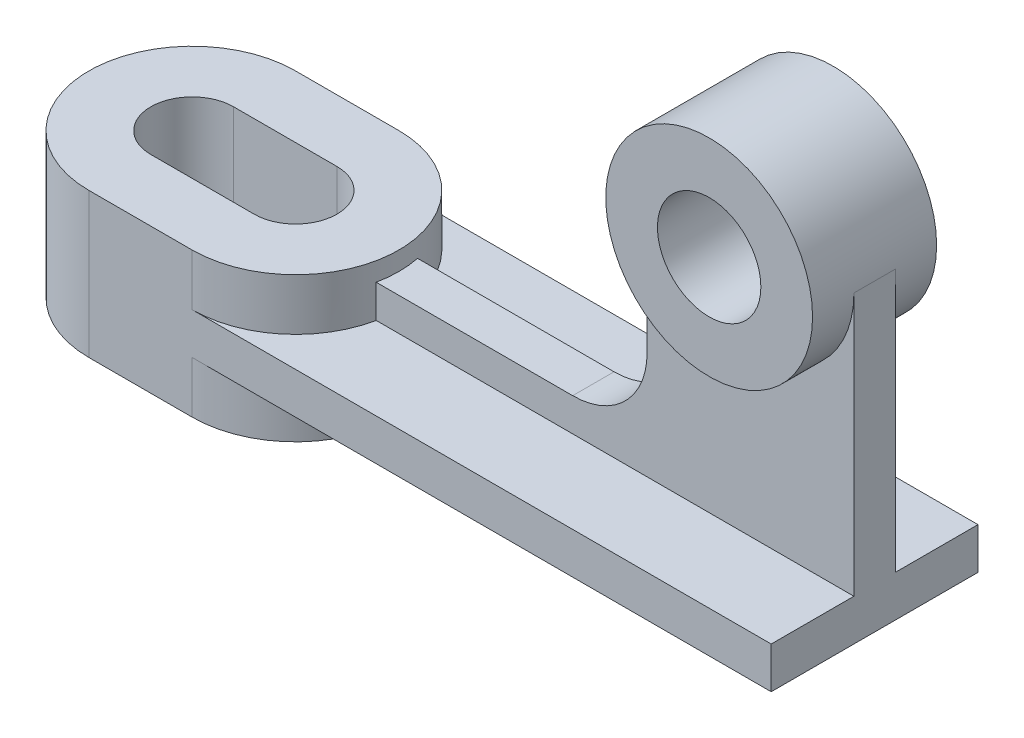
ISO-10303-21;
HEADER;
FILE_DESCRIPTION(('STEP AP214'),'2;1');
FILE_NAME('part.step','',(''),(''),'','','');
FILE_SCHEMA(('AUTOMOTIVE_DESIGN { 1 0 10303 214 1 1 1 1 }'));
ENDSEC;
DATA;
#1=APPLICATION_CONTEXT('core data for automotive mechanical design processes');
#2=APPLICATION_PROTOCOL_DEFINITION('international standard','automotive_design',2000,#1);
#3=PRODUCT_CONTEXT('',#1,'mechanical');
#4=PRODUCT('Part','Part','',(#3));
#5=PRODUCT_RELATED_PRODUCT_CATEGORY('part','',(#4));
#6=PRODUCT_DEFINITION_FORMATION('','',#4);
#7=PRODUCT_DEFINITION_CONTEXT('part definition',#1,'design');
#8=PRODUCT_DEFINITION('design','',#6,#7);
#9=PRODUCT_DEFINITION_SHAPE('','',#8);
#10=(LENGTH_UNIT() NAMED_UNIT(*) SI_UNIT(.MILLI.,.METRE.));
#11=(NAMED_UNIT(*) PLANE_ANGLE_UNIT() SI_UNIT($,.RADIAN.));
#12=(NAMED_UNIT(*) SI_UNIT($,.STERADIAN.) SOLID_ANGLE_UNIT());
#13=UNCERTAINTY_MEASURE_WITH_UNIT(LENGTH_MEASURE(1.E-05),#10,'distance_accuracy_value','');
#14=(GEOMETRIC_REPRESENTATION_CONTEXT(3) GLOBAL_UNCERTAINTY_ASSIGNED_CONTEXT((#13)) GLOBAL_UNIT_ASSIGNED_CONTEXT((#10,
#11,#12)) REPRESENTATION_CONTEXT('',''));
#15=CARTESIAN_POINT('',(0.,0.,0.));
#16=DIRECTION('',(0.,0.,1.));
#17=DIRECTION('',(1.,0.,0.));
#18=AXIS2_PLACEMENT_3D('',#15,#16,#17);
#19=CARTESIAN_POINT('',(0.,18.,0.));
#20=DIRECTION('',(0.,1.,0.));
#21=DIRECTION('',(0.,0.,1.));
#22=AXIS2_PLACEMENT_3D('',#19,#20,#21);
#23=PLANE('',#22);
#24=DIRECTION('',(-1.,0.,0.));
#25=VECTOR('',#24,1.);
#26=CARTESIAN_POINT('',(0.,18.,5.));
#27=LINE('',#26,#25);
#28=CARTESIAN_POINT('',(26.3753555150692,18.,5.));
#29=VERTEX_POINT('',#28);
#30=CARTESIAN_POINT('',(-21.1297470570989,18.,5.));
#31=VERTEX_POINT('',#30);
#32=EDGE_CURVE('E207',#29,#31,#27,.T.);
#33=ORIENTED_EDGE('',*,*,#32,.F.);
#34=DIRECTION('',(0.,0.,1.));
#35=VECTOR('',#34,1.);
#36=CARTESIAN_POINT('',(26.3753555150692,18.,-5.));
#37=LINE('',#36,#35);
#38=CARTESIAN_POINT('',(26.3753555150692,18.,-5.));
#39=VERTEX_POINT('',#38);
#40=EDGE_CURVE('E209',#39,#29,#37,.T.);
#41=ORIENTED_EDGE('',*,*,#40,.F.);
#42=DIRECTION('',(-1.,0.,0.));
#43=VECTOR('',#42,1.);
#44=CARTESIAN_POINT('',(0.,18.,-5.));
#45=LINE('',#44,#43);
#46=CARTESIAN_POINT('',(-21.1297470570989,18.,-5.));
#47=VERTEX_POINT('',#46);
#48=EDGE_CURVE('E220',#39,#47,#45,.T.);
#49=ORIENTED_EDGE('',*,*,#48,.T.);
#50=CARTESIAN_POINT('',(-45.6246444849307,18.,0.));
#51=DIRECTION('',(0.,1.,0.));
#52=DIRECTION('',(0.,0.,1.));
#53=AXIS2_PLACEMENT_3D('',#50,#51,#52);
#54=CIRCLE('',#53,25.);
#55=EDGE_CURVE('E201',#31,#47,#54,.T.);
#56=ORIENTED_EDGE('',*,*,#55,.F.);
#57=EDGE_LOOP('',(#33,#41,#49,#56));
#58=FACE_BOUND('',#57,.T.);
#59=ADVANCED_FACE('F41',(#58),#23,.T.);
#60=CARTESIAN_POINT('',(-45.6246444849307,-12.5,0.));
#61=DIRECTION('',(0.,1.,0.));
#62=DIRECTION('',(0.,0.,1.));
#63=AXIS2_PLACEMENT_3D('',#60,#61,#62);
#64=CYLINDRICAL_SURFACE('',#63,25.);
#65=DIRECTION('',(0.,1.,0.));
#66=VECTOR('',#65,1.);
#67=CARTESIAN_POINT('',(-45.6246444849307,-12.5,-25.));
#68=LINE('',#67,#66);
#69=CARTESIAN_POINT('',(-45.6246444849307,-12.5,-25.));
#70=VERTEX_POINT('',#69);
#71=CARTESIAN_POINT('',(-45.6246444849307,0.,-25.));
#72=VERTEX_POINT('',#71);
#73=EDGE_CURVE('E345',#70,#72,#68,.T.);
#74=ORIENTED_EDGE('',*,*,#73,.T.);
#75=CARTESIAN_POINT('',(-45.6246444849307,0.,0.));
#76=DIRECTION('',(0.,1.,0.));
#77=DIRECTION('',(0.,0.,1.));
#78=AXIS2_PLACEMENT_3D('',#75,#76,#77);
#79=CIRCLE('',#78,25.);
#80=CARTESIAN_POINT('',(-45.6246444849307,0.,25.));
#81=VERTEX_POINT('',#80);
#82=EDGE_CURVE('E256',#81,#72,#79,.T.);
#83=ORIENTED_EDGE('',*,*,#82,.F.);
#84=DIRECTION('',(0.,1.,0.));
#85=VECTOR('',#84,1.);
#86=CARTESIAN_POINT('',(-45.6246444849307,-12.5,25.));
#87=LINE('',#86,#85);
#88=CARTESIAN_POINT('',(-45.6246444849307,-12.5,25.));
#89=VERTEX_POINT('',#88);
#90=EDGE_CURVE('E350',#89,#81,#87,.T.);
#91=ORIENTED_EDGE('',*,*,#90,.F.);
#92=CARTESIAN_POINT('',(-45.6246444849307,-12.5,0.));
#93=DIRECTION('',(0.,1.,0.));
#94=DIRECTION('',(0.,0.,1.));
#95=AXIS2_PLACEMENT_3D('',#92,#93,#94);
#96=CIRCLE('',#95,25.);
#97=EDGE_CURVE('E332',#89,#70,#96,.T.);
#98=ORIENTED_EDGE('',*,*,#97,.T.);
#99=EDGE_LOOP('',(#74,#83,#91,#98));
#100=FACE_BOUND('',#99,.T.);
#101=ADVANCED_FACE('F388',(#100),#64,.T.);
#102=CARTESIAN_POINT('',(0.,-12.5,25.));
#103=DIRECTION('',(0.,0.,1.));
#104=DIRECTION('',(1.,0.,0.));
#105=AXIS2_PLACEMENT_3D('',#102,#103,#104);
#106=PLANE('',#105);
#107=ORIENTED_EDGE('',*,*,#90,.T.);
#108=DIRECTION('',(-1.,0.,0.));
#109=VECTOR('',#108,1.);
#110=CARTESIAN_POINT('',(0.,0.,25.));
#111=LINE('',#110,#109);
#112=CARTESIAN_POINT('',(94.3753555150693,0.,25.));
#113=VERTEX_POINT('',#112);
#114=EDGE_CURVE('E67',#113,#81,#111,.T.);
#115=ORIENTED_EDGE('',*,*,#114,.F.);
#116=DIRECTION('',(0.,-1.,0.));
#117=VECTOR('',#116,1.);
#118=CARTESIAN_POINT('',(94.3753555150693,10.,25.));
#119=LINE('',#118,#117);
#120=CARTESIAN_POINT('',(94.3753555150693,10.,25.));
#121=VERTEX_POINT('',#120);
#122=EDGE_CURVE('E274',#121,#113,#119,.T.);
#123=ORIENTED_EDGE('',*,*,#122,.F.);
#124=DIRECTION('',(-1.,0.,0.));
#125=VECTOR('',#124,1.);
#126=CARTESIAN_POINT('',(0.,10.,25.));
#127=LINE('',#126,#125);
#128=CARTESIAN_POINT('',(-45.6246444849307,10.,25.));
#129=VERTEX_POINT('',#128);
#130=EDGE_CURVE('E261',#121,#129,#127,.T.);
#131=ORIENTED_EDGE('',*,*,#130,.T.);
#132=CARTESIAN_POINT('',(-45.6246444849307,22.5,25.));
#133=VERTEX_POINT('',#132);
#134=EDGE_CURVE('E354',#129,#133,#87,.T.);
#135=ORIENTED_EDGE('',*,*,#134,.T.);
#136=DIRECTION('',(1.,0.,0.));
#137=VECTOR('',#136,1.);
#138=CARTESIAN_POINT('',(0.,22.5,25.));
#139=LINE('',#138,#137);
#140=CARTESIAN_POINT('',(-70.6246444849307,22.5,25.));
#141=VERTEX_POINT('',#140);
#142=EDGE_CURVE('E299',#141,#133,#139,.T.);
#143=ORIENTED_EDGE('',*,*,#142,.F.);
#144=DIRECTION('',(0.,1.,0.));
#145=VECTOR('',#144,1.);
#146=CARTESIAN_POINT('',(-70.6246444849307,-12.5,25.));
#147=LINE('',#146,#145);
#148=CARTESIAN_POINT('',(-70.6246444849307,-12.5,25.));
#149=VERTEX_POINT('',#148);
#150=EDGE_CURVE('E11',#149,#141,#147,.T.);
#151=ORIENTED_EDGE('',*,*,#150,.F.);
#152=DIRECTION('',(1.,0.,0.));
#153=VECTOR('',#152,1.);
#154=CARTESIAN_POINT('',(0.,-12.5,25.));
#155=LINE('',#154,#153);
#156=EDGE_CURVE('E328',#149,#89,#155,.T.);
#157=ORIENTED_EDGE('',*,*,#156,.T.);
#158=EDGE_LOOP('',(#107,#115,#123,#131,#135,#143,#151,#157));
#159=FACE_BOUND('',#158,.T.);
#160=ADVANCED_FACE('F398',(#159),#106,.T.);
#161=CARTESIAN_POINT('',(-70.6246444849307,-12.5,0.));
#162=DIRECTION('',(0.,1.,0.));
#163=DIRECTION('',(0.,0.,1.));
#164=AXIS2_PLACEMENT_3D('',#161,#162,#163);
#165=CYLINDRICAL_SURFACE('',#164,25.);
#166=ORIENTED_EDGE('',*,*,#150,.T.);
#167=CARTESIAN_POINT('',(-70.6246444849307,22.5,0.));
#168=DIRECTION('',(0.,1.,0.));
#169=DIRECTION('',(0.,0.,1.));
#170=AXIS2_PLACEMENT_3D('',#167,#168,#169);
#171=CIRCLE('',#170,25.);
#172=CARTESIAN_POINT('',(-70.6246444849307,22.5,-25.));
#173=VERTEX_POINT('',#172);
#174=EDGE_CURVE('E311',#173,#141,#171,.T.);
#175=ORIENTED_EDGE('',*,*,#174,.F.);
#176=DIRECTION('',(0.,1.,0.));
#177=VECTOR('',#176,1.);
#178=CARTESIAN_POINT('',(-70.6246444849307,-12.5,-25.));
#179=LINE('',#178,#177);
#180=CARTESIAN_POINT('',(-70.6246444849307,-12.5,-25.));
#181=VERTEX_POINT('',#180);
#182=EDGE_CURVE('E51',#181,#173,#179,.T.);
#183=ORIENTED_EDGE('',*,*,#182,.F.);
#184=CARTESIAN_POINT('',(-70.6246444849307,-12.5,0.));
#185=DIRECTION('',(0.,1.,0.));
#186=DIRECTION('',(0.,0.,1.));
#187=AXIS2_PLACEMENT_3D('',#184,#185,#186);
#188=CIRCLE('',#187,25.);
#189=EDGE_CURVE('E339',#181,#149,#188,.T.);
#190=ORIENTED_EDGE('',*,*,#189,.T.);
#191=EDGE_LOOP('',(#166,#175,#183,#190));
#192=FACE_BOUND('',#191,.T.);
#193=ADVANCED_FACE('F430',(#192),#165,.T.);
#194=CARTESIAN_POINT('',(0.,-12.5,-25.));
#195=DIRECTION('',(0.,0.,1.));
#196=DIRECTION('',(1.,0.,0.));
#197=AXIS2_PLACEMENT_3D('',#194,#195,#196);
#198=PLANE('',#197);
#199=ORIENTED_EDGE('',*,*,#182,.T.);
#200=DIRECTION('',(1.,0.,0.));
#201=VECTOR('',#200,1.);
#202=CARTESIAN_POINT('',(0.,22.5,-25.));
#203=LINE('',#202,#201);
#204=CARTESIAN_POINT('',(-45.6246444849307,22.5,-25.));
#205=VERTEX_POINT('',#204);
#206=EDGE_CURVE('E307',#173,#205,#203,.T.);
#207=ORIENTED_EDGE('',*,*,#206,.T.);
#208=CARTESIAN_POINT('',(-45.6246444849307,10.,-25.));
#209=VERTEX_POINT('',#208);
#210=EDGE_CURVE('E349',#209,#205,#68,.T.);
#211=ORIENTED_EDGE('',*,*,#210,.F.);
#212=DIRECTION('',(-1.,0.,0.));
#213=VECTOR('',#212,1.);
#214=CARTESIAN_POINT('',(0.,10.,-25.));
#215=LINE('',#214,#213);
#216=CARTESIAN_POINT('',(94.3753555150693,10.,-25.));
#217=VERTEX_POINT('',#216);
#218=EDGE_CURVE('E246',#217,#209,#215,.T.);
#219=ORIENTED_EDGE('',*,*,#218,.F.);
#220=DIRECTION('',(0.,-1.,0.));
#221=VECTOR('',#220,1.);
#222=CARTESIAN_POINT('',(94.3753555150693,10.,-25.));
#223=LINE('',#222,#221);
#224=CARTESIAN_POINT('',(94.3753555150693,0.,-25.));
#225=VERTEX_POINT('',#224);
#226=EDGE_CURVE('E249',#217,#225,#223,.T.);
#227=ORIENTED_EDGE('',*,*,#226,.T.);
#228=DIRECTION('',(-1.,0.,0.));
#229=VECTOR('',#228,1.);
#230=CARTESIAN_POINT('',(0.,0.,-25.));
#231=LINE('',#230,#229);
#232=EDGE_CURVE('E235',#225,#72,#231,.T.);
#233=ORIENTED_EDGE('',*,*,#232,.T.);
#234=ORIENTED_EDGE('',*,*,#73,.F.);
#235=DIRECTION('',(1.,0.,0.));
#236=VECTOR('',#235,1.);
#237=CARTESIAN_POINT('',(0.,-12.5,-25.));
#238=LINE('',#237,#236);
#239=EDGE_CURVE('E336',#181,#70,#238,.T.);
#240=ORIENTED_EDGE('',*,*,#239,.F.);
#241=EDGE_LOOP('',(#199,#207,#211,#219,#227,#233,#234,#240));
#242=FACE_BOUND('',#241,.T.);
#243=ADVANCED_FACE('F433',(#242),#198,.F.);
#244=CARTESIAN_POINT('',(-45.6246444849307,-12.5,0.));
#245=DIRECTION('',(0.,1.,0.));
#246=DIRECTION('',(0.,0.,1.));
#247=AXIS2_PLACEMENT_3D('',#244,#245,#246);
#248=CYLINDRICAL_SURFACE('',#247,10.);
#249=DIRECTION('',(0.,1.,0.));
#250=VECTOR('',#249,1.);
#251=CARTESIAN_POINT('',(-45.6246444849307,-12.5,10.));
#252=LINE('',#251,#250);
#253=CARTESIAN_POINT('',(-45.6246444849307,-12.5,10.));
#254=VERTEX_POINT('',#253);
#255=CARTESIAN_POINT('',(-45.6246444849307,22.5,10.));
#256=VERTEX_POINT('',#255);
#257=EDGE_CURVE('E45',#254,#256,#252,.T.);
#258=ORIENTED_EDGE('',*,*,#257,.T.);
#259=CARTESIAN_POINT('',(-45.6246444849307,22.5,0.));
#260=DIRECTION('',(0.,1.,0.));
#261=DIRECTION('',(0.,0.,1.));
#262=AXIS2_PLACEMENT_3D('',#259,#260,#261);
#263=CIRCLE('',#262,10.);
#264=CARTESIAN_POINT('',(-45.6246444849307,22.5,-10.));
#265=VERTEX_POINT('',#264);
#266=EDGE_CURVE('E283',#256,#265,#263,.T.);
#267=ORIENTED_EDGE('',*,*,#266,.T.);
#268=DIRECTION('',(0.,1.,0.));
#269=VECTOR('',#268,1.);
#270=CARTESIAN_POINT('',(-45.6246444849307,-12.5,-10.));
#271=LINE('',#270,#269);
#272=CARTESIAN_POINT('',(-45.6246444849307,-12.5,-10.));
#273=VERTEX_POINT('',#272);
#274=EDGE_CURVE('E355',#273,#265,#271,.T.);
#275=ORIENTED_EDGE('',*,*,#274,.F.);
#276=CARTESIAN_POINT('',(-45.6246444849307,-12.5,0.));
#277=DIRECTION('',(0.,1.,0.));
#278=DIRECTION('',(0.,0.,1.));
#279=AXIS2_PLACEMENT_3D('',#276,#277,#278);
#280=CIRCLE('',#279,10.);
#281=EDGE_CURVE('E315',#254,#273,#280,.T.);
#282=ORIENTED_EDGE('',*,*,#281,.F.);
#283=EDGE_LOOP('',(#258,#267,#275,#282));
#284=FACE_BOUND('',#283,.T.);
#285=ADVANCED_FACE('F43',(#284),#248,.F.);
#286=CARTESIAN_POINT('',(0.,-12.5,-10.));
#287=DIRECTION('',(0.,0.,1.));
#288=DIRECTION('',(1.,0.,0.));
#289=AXIS2_PLACEMENT_3D('',#286,#287,#288);
#290=PLANE('',#289);
#291=ORIENTED_EDGE('',*,*,#274,.T.);
#292=DIRECTION('',(1.,0.,0.));
#293=VECTOR('',#292,1.);
#294=CARTESIAN_POINT('',(0.,22.5,-10.));
#295=LINE('',#294,#293);
#296=CARTESIAN_POINT('',(-70.6246444849307,22.5,-10.));
#297=VERTEX_POINT('',#296);
#298=EDGE_CURVE('E295',#297,#265,#295,.T.);
#299=ORIENTED_EDGE('',*,*,#298,.F.);
#300=DIRECTION('',(0.,1.,0.));
#301=VECTOR('',#300,1.);
#302=CARTESIAN_POINT('',(-70.6246444849307,-12.5,-10.));
#303=LINE('',#302,#301);
#304=CARTESIAN_POINT('',(-70.6246444849307,-12.5,-10.));
#305=VERTEX_POINT('',#304);
#306=EDGE_CURVE('E358',#305,#297,#303,.T.);
#307=ORIENTED_EDGE('',*,*,#306,.F.);
#308=DIRECTION('',(1.,0.,0.));
#309=VECTOR('',#308,1.);
#310=CARTESIAN_POINT('',(0.,-12.5,-10.));
#311=LINE('',#310,#309);
#312=EDGE_CURVE('E324',#305,#273,#311,.T.);
#313=ORIENTED_EDGE('',*,*,#312,.T.);
#314=EDGE_LOOP('',(#291,#299,#307,#313));
#315=FACE_BOUND('',#314,.T.);
#316=ADVANCED_FACE('F389',(#315),#290,.T.);
#317=CARTESIAN_POINT('',(-70.6246444849307,-12.5,0.));
#318=DIRECTION('',(0.,1.,0.));
#319=DIRECTION('',(0.,0.,1.));
#320=AXIS2_PLACEMENT_3D('',#317,#318,#319);
#321=CYLINDRICAL_SURFACE('',#320,10.);
#322=ORIENTED_EDGE('',*,*,#306,.T.);
#323=CARTESIAN_POINT('',(-70.6246444849307,22.5,0.));
#324=DIRECTION('',(0.,1.,0.));
#325=DIRECTION('',(0.,0.,1.));
#326=AXIS2_PLACEMENT_3D('',#323,#324,#325);
#327=CIRCLE('',#326,10.);
#328=CARTESIAN_POINT('',(-70.6246444849307,22.5,10.));
#329=VERTEX_POINT('',#328);
#330=EDGE_CURVE('E291',#297,#329,#327,.T.);
#331=ORIENTED_EDGE('',*,*,#330,.T.);
#332=DIRECTION('',(0.,1.,0.));
#333=VECTOR('',#332,1.);
#334=CARTESIAN_POINT('',(-70.6246444849307,-12.5,10.));
#335=LINE('',#334,#333);
#336=CARTESIAN_POINT('',(-70.6246444849307,-12.5,10.));
#337=VERTEX_POINT('',#336);
#338=EDGE_CURVE('E360',#337,#329,#335,.T.);
#339=ORIENTED_EDGE('',*,*,#338,.F.);
#340=CARTESIAN_POINT('',(-70.6246444849307,-12.5,0.));
#341=DIRECTION('',(0.,1.,0.));
#342=DIRECTION('',(0.,0.,1.));
#343=AXIS2_PLACEMENT_3D('',#340,#341,#342);
#344=CIRCLE('',#343,10.);
#345=EDGE_CURVE('E321',#305,#337,#344,.T.);
#346=ORIENTED_EDGE('',*,*,#345,.F.);
#347=EDGE_LOOP('',(#322,#331,#339,#346));
#348=FACE_BOUND('',#347,.T.);
#349=ADVANCED_FACE('F380',(#348),#321,.F.);
#350=CARTESIAN_POINT('',(0.,-12.5,10.));
#351=DIRECTION('',(0.,0.,1.));
#352=DIRECTION('',(1.,0.,0.));
#353=AXIS2_PLACEMENT_3D('',#350,#351,#352);
#354=PLANE('',#353);
#355=ORIENTED_EDGE('',*,*,#338,.T.);
#356=DIRECTION('',(1.,0.,0.));
#357=VECTOR('',#356,1.);
#358=CARTESIAN_POINT('',(0.,22.5,10.));
#359=LINE('',#358,#357);
#360=EDGE_CURVE('E287',#329,#256,#359,.T.);
#361=ORIENTED_EDGE('',*,*,#360,.T.);
#362=ORIENTED_EDGE('',*,*,#257,.F.);
#363=DIRECTION('',(1.,0.,0.));
#364=VECTOR('',#363,1.);
#365=CARTESIAN_POINT('',(0.,-12.5,10.));
#366=LINE('',#365,#364);
#367=EDGE_CURVE('E318',#337,#254,#366,.T.);
#368=ORIENTED_EDGE('',*,*,#367,.F.);
#369=EDGE_LOOP('',(#355,#361,#362,#368));
#370=FACE_BOUND('',#369,.T.);
#371=ADVANCED_FACE('F377',(#370),#354,.F.);
#372=DIRECTION('',(0.,-1.,0.));
#373=VECTOR('',#372,1.);
#374=CARTESIAN_POINT('',(-21.1297470570989,18.,5.));
#375=LINE('',#374,#373);
#376=CARTESIAN_POINT('',(-21.1297470570989,10.,5.));
#377=VERTEX_POINT('',#376);
#378=EDGE_CURVE('E232',#31,#377,#375,.T.);
#379=ORIENTED_EDGE('',*,*,#378,.F.);
#380=ORIENTED_EDGE('',*,*,#55,.T.);
#381=DIRECTION('',(0.,-1.,0.));
#382=VECTOR('',#381,1.);
#383=CARTESIAN_POINT('',(-21.1297470570989,18.,-5.));
#384=LINE('',#383,#382);
#385=CARTESIAN_POINT('',(-21.1297470570989,10.,-5.));
#386=VERTEX_POINT('',#385);
#387=EDGE_CURVE('E223',#47,#386,#384,.T.);
#388=ORIENTED_EDGE('',*,*,#387,.T.);
#389=CARTESIAN_POINT('',(-45.6246444849307,10.,0.));
#390=DIRECTION('',(0.,1.,0.));
#391=DIRECTION('',(0.,0.,1.));
#392=AXIS2_PLACEMENT_3D('',#389,#390,#391);
#393=CIRCLE('',#392,25.);
#394=EDGE_CURVE('E236',#386,#209,#393,.T.);
#395=ORIENTED_EDGE('',*,*,#394,.T.);
#396=ORIENTED_EDGE('',*,*,#210,.T.);
#397=CARTESIAN_POINT('',(-45.6246444849307,22.5,0.));
#398=DIRECTION('',(0.,1.,0.));
#399=DIRECTION('',(0.,0.,1.));
#400=AXIS2_PLACEMENT_3D('',#397,#398,#399);
#401=CIRCLE('',#400,25.);
#402=EDGE_CURVE('E303',#133,#205,#401,.T.);
#403=ORIENTED_EDGE('',*,*,#402,.F.);
#404=ORIENTED_EDGE('',*,*,#134,.F.);
#405=CARTESIAN_POINT('',(-45.6246444849307,10.,0.));
#406=DIRECTION('',(0.,1.,0.));
#407=DIRECTION('',(0.,0.,1.));
#408=AXIS2_PLACEMENT_3D('',#405,#406,#407);
#409=CIRCLE('',#408,25.);
#410=EDGE_CURVE('E257',#129,#377,#409,.T.);
#411=ORIENTED_EDGE('',*,*,#410,.T.);
#412=EDGE_LOOP('',(#379,#380,#388,#395,#396,#403,#404,#411));
#413=FACE_BOUND('',#412,.T.);
#414=ADVANCED_FACE('F379',(#413),#64,.T.);
#415=CARTESIAN_POINT('',(0.,-12.5,0.));
#416=DIRECTION('',(0.,1.,0.));
#417=DIRECTION('',(0.,0.,1.));
#418=AXIS2_PLACEMENT_3D('',#415,#416,#417);
#419=PLANE('',#418);
#420=ORIENTED_EDGE('',*,*,#281,.T.);
#421=ORIENTED_EDGE('',*,*,#312,.F.);
#422=ORIENTED_EDGE('',*,*,#345,.T.);
#423=ORIENTED_EDGE('',*,*,#367,.T.);
#424=EDGE_LOOP('',(#420,#421,#422,#423));
#425=FACE_BOUND('',#424,.T.);
#426=ORIENTED_EDGE('',*,*,#156,.F.);
#427=ORIENTED_EDGE('',*,*,#189,.F.);
#428=ORIENTED_EDGE('',*,*,#239,.T.);
#429=ORIENTED_EDGE('',*,*,#97,.F.);
#430=EDGE_LOOP('',(#426,#427,#428,#429));
#431=FACE_BOUND('',#430,.T.);
#432=ADVANCED_FACE('F385',(#425,#431),#419,.F.);
#433=CARTESIAN_POINT('',(0.,22.5,0.));
#434=DIRECTION('',(0.,1.,0.));
#435=DIRECTION('',(0.,0.,1.));
#436=AXIS2_PLACEMENT_3D('',#433,#434,#435);
#437=PLANE('',#436);
#438=ORIENTED_EDGE('',*,*,#266,.F.);
#439=ORIENTED_EDGE('',*,*,#360,.F.);
#440=ORIENTED_EDGE('',*,*,#330,.F.);
#441=ORIENTED_EDGE('',*,*,#298,.T.);
#442=EDGE_LOOP('',(#438,#439,#440,#441));
#443=FACE_BOUND('',#442,.T.);
#444=ORIENTED_EDGE('',*,*,#142,.T.);
#445=ORIENTED_EDGE('',*,*,#402,.T.);
#446=ORIENTED_EDGE('',*,*,#206,.F.);
#447=ORIENTED_EDGE('',*,*,#174,.T.);
#448=EDGE_LOOP('',(#444,#445,#446,#447));
#449=FACE_BOUND('',#448,.T.);
#450=ADVANCED_FACE('F373',(#443,#449),#437,.T.);
#451=CARTESIAN_POINT('',(94.3753555150693,10.,0.));
#452=DIRECTION('',(-1.,0.,0.));
#453=DIRECTION('',(0.,0.,1.));
#454=AXIS2_PLACEMENT_3D('',#451,#452,#453);
#455=PLANE('',#454);
#456=DIRECTION('',(0.,0.,-1.));
#457=VECTOR('',#456,1.);
#458=CARTESIAN_POINT('',(94.3753555150693,0.,0.));
#459=LINE('',#458,#457);
#460=EDGE_CURVE('E262',#113,#225,#459,.T.);
#461=ORIENTED_EDGE('',*,*,#460,.T.);
#462=ORIENTED_EDGE('',*,*,#226,.F.);
#463=DIRECTION('',(0.,0.,-1.));
#464=VECTOR('',#463,1.);
#465=CARTESIAN_POINT('',(94.3753555150693,10.,0.));
#466=LINE('',#465,#464);
#467=CARTESIAN_POINT('',(94.3753555150693,10.,-5.));
#468=VERTEX_POINT('',#467);
#469=EDGE_CURVE('E243',#468,#217,#466,.T.);
#470=ORIENTED_EDGE('',*,*,#469,.F.);
#471=DIRECTION('',(0.,-1.,0.));
#472=VECTOR('',#471,1.);
#473=CARTESIAN_POINT('',(94.3753555150693,18.,-5.));
#474=LINE('',#473,#472);
#475=CARTESIAN_POINT('',(94.3753555150693,73.5,-5.));
#476=VERTEX_POINT('',#475);
#477=EDGE_CURVE('E227',#476,#468,#474,.T.);
#478=ORIENTED_EDGE('',*,*,#477,.F.);
#479=DIRECTION('',(0.,0.,1.));
#480=VECTOR('',#479,1.);
#481=CARTESIAN_POINT('',(94.3753555150693,73.5,-5.));
#482=LINE('',#481,#480);
#483=CARTESIAN_POINT('',(94.3753555150693,73.5,5.));
#484=VERTEX_POINT('',#483);
#485=EDGE_CURVE('E202',#476,#484,#482,.T.);
#486=ORIENTED_EDGE('',*,*,#485,.T.);
#487=DIRECTION('',(0.,-1.,0.));
#488=VECTOR('',#487,1.);
#489=CARTESIAN_POINT('',(94.3753555150693,18.,5.));
#490=LINE('',#489,#488);
#491=CARTESIAN_POINT('',(94.3753555150693,10.,5.));
#492=VERTEX_POINT('',#491);
#493=EDGE_CURVE('E179',#484,#492,#490,.T.);
#494=ORIENTED_EDGE('',*,*,#493,.T.);
#495=DIRECTION('',(0.,0.,-1.));
#496=VECTOR('',#495,1.);
#497=CARTESIAN_POINT('',(94.3753555150693,10.,0.));
#498=LINE('',#497,#496);
#499=EDGE_CURVE('E266',#121,#492,#498,.T.);
#500=ORIENTED_EDGE('',*,*,#499,.F.);
#501=ORIENTED_EDGE('',*,*,#122,.T.);
#502=EDGE_LOOP('',(#461,#462,#470,#478,#486,#494,#500,#501));
#503=FACE_BOUND('',#502,.T.);
#504=ADVANCED_FACE('F418',(#503),#455,.F.);
#505=CARTESIAN_POINT('',(0.,10.,0.));
#506=DIRECTION('',(0.,1.,0.));
#507=DIRECTION('',(0.,0.,1.));
#508=AXIS2_PLACEMENT_3D('',#505,#506,#507);
#509=PLANE('',#508);
#510=ORIENTED_EDGE('',*,*,#410,.F.);
#511=ORIENTED_EDGE('',*,*,#130,.F.);
#512=ORIENTED_EDGE('',*,*,#499,.T.);
#513=DIRECTION('',(-1.,0.,0.));
#514=VECTOR('',#513,1.);
#515=CARTESIAN_POINT('',(0.,10.,5.));
#516=LINE('',#515,#514);
#517=EDGE_CURVE('E270',#492,#377,#516,.T.);
#518=ORIENTED_EDGE('',*,*,#517,.T.);
#519=EDGE_LOOP('',(#510,#511,#512,#518));
#520=FACE_BOUND('',#519,.T.);
#521=ADVANCED_FACE('F415',(#520),#509,.T.);
#522=CARTESIAN_POINT('',(0.,0.,0.));
#523=DIRECTION('',(0.,1.,0.));
#524=DIRECTION('',(0.,0.,1.));
#525=AXIS2_PLACEMENT_3D('',#522,#523,#524);
#526=PLANE('',#525);
#527=ORIENTED_EDGE('',*,*,#82,.T.);
#528=ORIENTED_EDGE('',*,*,#232,.F.);
#529=ORIENTED_EDGE('',*,*,#460,.F.);
#530=ORIENTED_EDGE('',*,*,#114,.T.);
#531=EDGE_LOOP('',(#527,#528,#529,#530));
#532=FACE_BOUND('',#531,.T.);
#533=ADVANCED_FACE('F413',(#532),#526,.F.);
#534=CARTESIAN_POINT('',(0.,10.,0.));
#535=DIRECTION('',(0.,1.,0.));
#536=DIRECTION('',(0.,0.,1.));
#537=AXIS2_PLACEMENT_3D('',#534,#535,#536);
#538=PLANE('',#537);
#539=ORIENTED_EDGE('',*,*,#394,.F.);
#540=DIRECTION('',(-1.,0.,0.));
#541=VECTOR('',#540,1.);
#542=CARTESIAN_POINT('',(0.,10.,-5.));
#543=LINE('',#542,#541);
#544=EDGE_CURVE('E240',#468,#386,#543,.T.);
#545=ORIENTED_EDGE('',*,*,#544,.F.);
#546=ORIENTED_EDGE('',*,*,#469,.T.);
#547=ORIENTED_EDGE('',*,*,#218,.T.);
#548=EDGE_LOOP('',(#539,#545,#546,#547));
#549=FACE_BOUND('',#548,.T.);
#550=ADVANCED_FACE('F410',(#549),#538,.T.);
#551=CARTESIAN_POINT('',(0.,18.,5.));
#552=DIRECTION('',(0.,0.,1.));
#553=DIRECTION('',(1.,0.,0.));
#554=AXIS2_PLACEMENT_3D('',#551,#552,#553);
#555=PLANE('',#554);
#556=ORIENTED_EDGE('',*,*,#378,.T.);
#557=ORIENTED_EDGE('',*,*,#517,.F.);
#558=ORIENTED_EDGE('',*,*,#493,.F.);
#559=CARTESIAN_POINT('',(69.3753555150693,73.5,5.));
#560=DIRECTION('',(0.,0.,1.));
#561=DIRECTION('',(1.,0.,0.));
#562=AXIS2_PLACEMENT_3D('',#559,#560,#561);
#563=CIRCLE('',#562,25.);
#564=CARTESIAN_POINT('',(44.3753555150694,73.5,5.));
#565=VERTEX_POINT('',#564);
#566=EDGE_CURVE('E174',#565,#484,#563,.T.);
#567=ORIENTED_EDGE('',*,*,#566,.F.);
#568=DIRECTION('',(0.,-1.,0.));
#569=VECTOR('',#568,1.);
#570=CARTESIAN_POINT('',(44.3753555150694,0.,5.));
#571=LINE('',#570,#569);
#572=CARTESIAN_POINT('',(44.3753555150694,36.0000000000001,5.));
#573=VERTEX_POINT('',#572);
#574=EDGE_CURVE('E177',#565,#573,#571,.T.);
#575=ORIENTED_EDGE('',*,*,#574,.T.);
#576=CARTESIAN_POINT('',(26.3753555150694,36.,5.));
#577=DIRECTION('',(0.,0.,1.));
#578=DIRECTION('',(1.,0.,0.));
#579=AXIS2_PLACEMENT_3D('',#576,#577,#578);
#580=CIRCLE('',#579,18.);
#581=EDGE_CURVE('E59',#573,#29,#580,.F.);
#582=ORIENTED_EDGE('',*,*,#581,.T.);
#583=ORIENTED_EDGE('',*,*,#32,.T.);
#584=EDGE_LOOP('',(#556,#557,#558,#567,#575,#582,#583));
#585=FACE_BOUND('',#584,.T.);
#586=ADVANCED_FACE('F176',(#585),#555,.T.);
#587=CARTESIAN_POINT('',(0.,18.,-5.));
#588=DIRECTION('',(0.,0.,1.));
#589=DIRECTION('',(1.,0.,0.));
#590=AXIS2_PLACEMENT_3D('',#587,#588,#589);
#591=PLANE('',#590);
#592=ORIENTED_EDGE('',*,*,#544,.T.);
#593=ORIENTED_EDGE('',*,*,#387,.F.);
#594=ORIENTED_EDGE('',*,*,#48,.F.);
#595=CARTESIAN_POINT('',(26.3753555150694,36.,-5.));
#596=DIRECTION('',(0.,0.,1.));
#597=DIRECTION('',(1.,0.,0.));
#598=AXIS2_PLACEMENT_3D('',#595,#596,#597);
#599=CIRCLE('',#598,18.);
#600=CARTESIAN_POINT('',(44.3753555150694,36.0000000000001,-5.));
#601=VERTEX_POINT('',#600);
#602=EDGE_CURVE('E473',#601,#39,#599,.F.);
#603=ORIENTED_EDGE('',*,*,#602,.F.);
#604=DIRECTION('',(0.,-1.,0.));
#605=VECTOR('',#604,1.);
#606=CARTESIAN_POINT('',(44.3753555150694,0.,-5.));
#607=LINE('',#606,#605);
#608=CARTESIAN_POINT('',(44.3753555150694,73.5,-5.));
#609=VERTEX_POINT('',#608);
#610=EDGE_CURVE('E185',#609,#601,#607,.T.);
#611=ORIENTED_EDGE('',*,*,#610,.F.);
#612=CARTESIAN_POINT('',(69.3753555150693,73.5,-5.));
#613=DIRECTION('',(0.,0.,1.));
#614=DIRECTION('',(1.,0.,0.));
#615=AXIS2_PLACEMENT_3D('',#612,#613,#614);
#616=CIRCLE('',#615,25.);
#617=EDGE_CURVE('E199',#609,#476,#616,.T.);
#618=ORIENTED_EDGE('',*,*,#617,.T.);
#619=ORIENTED_EDGE('',*,*,#477,.T.);
#620=EDGE_LOOP('',(#592,#593,#594,#603,#611,#618,#619));
#621=FACE_BOUND('',#620,.T.);
#622=ADVANCED_FACE('F404',(#621),#591,.F.);
#623=CARTESIAN_POINT('',(44.3753555150694,0.,-5.));
#624=DIRECTION('',(-1.,0.,0.));
#625=DIRECTION('',(0.,0.,1.));
#626=AXIS2_PLACEMENT_3D('',#623,#624,#625);
#627=PLANE('',#626);
#628=DIRECTION('',(0.,0.,1.));
#629=VECTOR('',#628,1.);
#630=CARTESIAN_POINT('',(44.3753555150694,36.0000000000001,-5.));
#631=LINE('',#630,#629);
#632=EDGE_CURVE('E192',#601,#573,#631,.T.);
#633=ORIENTED_EDGE('',*,*,#632,.T.);
#634=ORIENTED_EDGE('',*,*,#574,.F.);
#635=DIRECTION('',(0.,0.,1.));
#636=VECTOR('',#635,1.);
#637=CARTESIAN_POINT('',(44.3753555150694,73.5,-5.));
#638=LINE('',#637,#636);
#639=EDGE_CURVE('E190',#609,#565,#638,.T.);
#640=ORIENTED_EDGE('',*,*,#639,.F.);
#641=ORIENTED_EDGE('',*,*,#610,.T.);
#642=EDGE_LOOP('',(#633,#634,#640,#641));
#643=FACE_BOUND('',#642,.T.);
#644=ADVANCED_FACE('F188',(#643),#627,.T.);
#645=CARTESIAN_POINT('',(26.3753555150694,36.,-5.));
#646=DIRECTION('',(0.,0.,1.));
#647=DIRECTION('',(1.,0.,0.));
#648=AXIS2_PLACEMENT_3D('',#645,#646,#647);
#649=CYLINDRICAL_SURFACE('',#648,18.);
#650=ORIENTED_EDGE('',*,*,#40,.T.);
#651=ORIENTED_EDGE('',*,*,#581,.F.);
#652=ORIENTED_EDGE('',*,*,#632,.F.);
#653=ORIENTED_EDGE('',*,*,#602,.T.);
#654=EDGE_LOOP('',(#650,#651,#652,#653));
#655=FACE_BOUND('',#654,.T.);
#656=ADVANCED_FACE('F509',(#655),#649,.F.);
#657=CARTESIAN_POINT('',(69.3753555150693,73.5,-15.));
#658=DIRECTION('',(0.,0.,1.));
#659=DIRECTION('',(1.,0.,0.));
#660=AXIS2_PLACEMENT_3D('',#657,#658,#659);
#661=CYLINDRICAL_SURFACE('',#660,25.);
#662=CARTESIAN_POINT('',(69.3753555150693,73.5,15.));
#663=DIRECTION('',(0.,0.,1.));
#664=DIRECTION('',(1.,0.,0.));
#665=AXIS2_PLACEMENT_3D('',#662,#663,#664);
#666=CIRCLE('',#665,25.);
#667=CARTESIAN_POINT('',(94.3753555150693,73.5,15.));
#668=VERTEX_POINT('',#667);
#669=EDGE_CURVE('E489',#668,#668,#666,.T.);
#670=ORIENTED_EDGE('',*,*,#669,.F.);
#671=EDGE_LOOP('',(#670));
#672=FACE_BOUND('',#671,.T.);
#673=CARTESIAN_POINT('',(69.3753555150693,73.5,-15.));
#674=DIRECTION('',(0.,0.,1.));
#675=DIRECTION('',(1.,0.,0.));
#676=AXIS2_PLACEMENT_3D('',#673,#674,#675);
#677=CIRCLE('',#676,25.);
#678=CARTESIAN_POINT('',(94.3753555150693,73.5,-15.));
#679=VERTEX_POINT('',#678);
#680=EDGE_CURVE('E194',#679,#679,#677,.T.);
#681=ORIENTED_EDGE('',*,*,#680,.T.);
#682=EDGE_LOOP('',(#681));
#683=FACE_BOUND('',#682,.T.);
#684=ORIENTED_EDGE('',*,*,#485,.F.);
#685=ORIENTED_EDGE('',*,*,#617,.F.);
#686=ORIENTED_EDGE('',*,*,#639,.T.);
#687=ORIENTED_EDGE('',*,*,#566,.T.);
#688=EDGE_LOOP('',(#684,#685,#686,#687));
#689=FACE_BOUND('',#688,.T.);
#690=ADVANCED_FACE('F197',(#672,#683,#689),#661,.T.);
#691=CARTESIAN_POINT('',(69.3753555150693,73.5,-15.));
#692=DIRECTION('',(0.,0.,1.));
#693=DIRECTION('',(1.,0.,0.));
#694=AXIS2_PLACEMENT_3D('',#691,#692,#693);
#695=CYLINDRICAL_SURFACE('',#694,12.5);
#696=CARTESIAN_POINT('',(69.3753555150693,73.5,-15.));
#697=DIRECTION('',(0.,0.,1.));
#698=DIRECTION('',(1.,0.,0.));
#699=AXIS2_PLACEMENT_3D('',#696,#697,#698);
#700=CIRCLE('',#699,12.5);
#701=CARTESIAN_POINT('',(81.8753555150693,73.5,-15.));
#702=VERTEX_POINT('',#701);
#703=EDGE_CURVE('E485',#702,#702,#700,.T.);
#704=ORIENTED_EDGE('',*,*,#703,.F.);
#705=EDGE_LOOP('',(#704));
#706=FACE_BOUND('',#705,.T.);
#707=CARTESIAN_POINT('',(69.3753555150693,73.5,15.));
#708=DIRECTION('',(0.,0.,1.));
#709=DIRECTION('',(1.,0.,0.));
#710=AXIS2_PLACEMENT_3D('',#707,#708,#709);
#711=CIRCLE('',#710,12.5);
#712=CARTESIAN_POINT('',(81.8753555150693,73.5,15.));
#713=VERTEX_POINT('',#712);
#714=EDGE_CURVE('E493',#713,#713,#711,.T.);
#715=ORIENTED_EDGE('',*,*,#714,.T.);
#716=EDGE_LOOP('',(#715));
#717=FACE_BOUND('',#716,.T.);
#718=ADVANCED_FACE('F498',(#706,#717),#695,.F.);
#719=CARTESIAN_POINT('',(0.,0.,-15.));
#720=DIRECTION('',(0.,0.,1.));
#721=DIRECTION('',(1.,0.,0.));
#722=AXIS2_PLACEMENT_3D('',#719,#720,#721);
#723=PLANE('',#722);
#724=ORIENTED_EDGE('',*,*,#703,.T.);
#725=EDGE_LOOP('',(#724));
#726=FACE_BOUND('',#725,.T.);
#727=ORIENTED_EDGE('',*,*,#680,.F.);
#728=EDGE_LOOP('',(#727));
#729=FACE_BOUND('',#728,.T.);
#730=ADVANCED_FACE('F503',(#726,#729),#723,.F.);
#731=CARTESIAN_POINT('',(0.,0.,15.));
#732=DIRECTION('',(0.,0.,1.));
#733=DIRECTION('',(1.,0.,0.));
#734=AXIS2_PLACEMENT_3D('',#731,#732,#733);
#735=PLANE('',#734);
#736=ORIENTED_EDGE('',*,*,#714,.F.);
#737=EDGE_LOOP('',(#736));
#738=FACE_BOUND('',#737,.T.);
#739=ORIENTED_EDGE('',*,*,#669,.T.);
#740=EDGE_LOOP('',(#739));
#741=FACE_BOUND('',#740,.T.);
#742=ADVANCED_FACE('F500',(#738,#741),#735,.T.);
#743=CLOSED_SHELL('',(#59,#101,#160,#193,#243,#285,#316,#349,#371,#414,#432,#450,#504,#521,#533,
#550,#586,#622,#644,#656,#690,#718,#730,#742));
#744=MANIFOLD_SOLID_BREP('B2',#743);
#745=ADVANCED_BREP_SHAPE_REPRESENTATION('',(#18,#744),#14);
#746=SHAPE_DEFINITION_REPRESENTATION(#9,#745);
ENDSEC;
END-ISO-10303-21;
